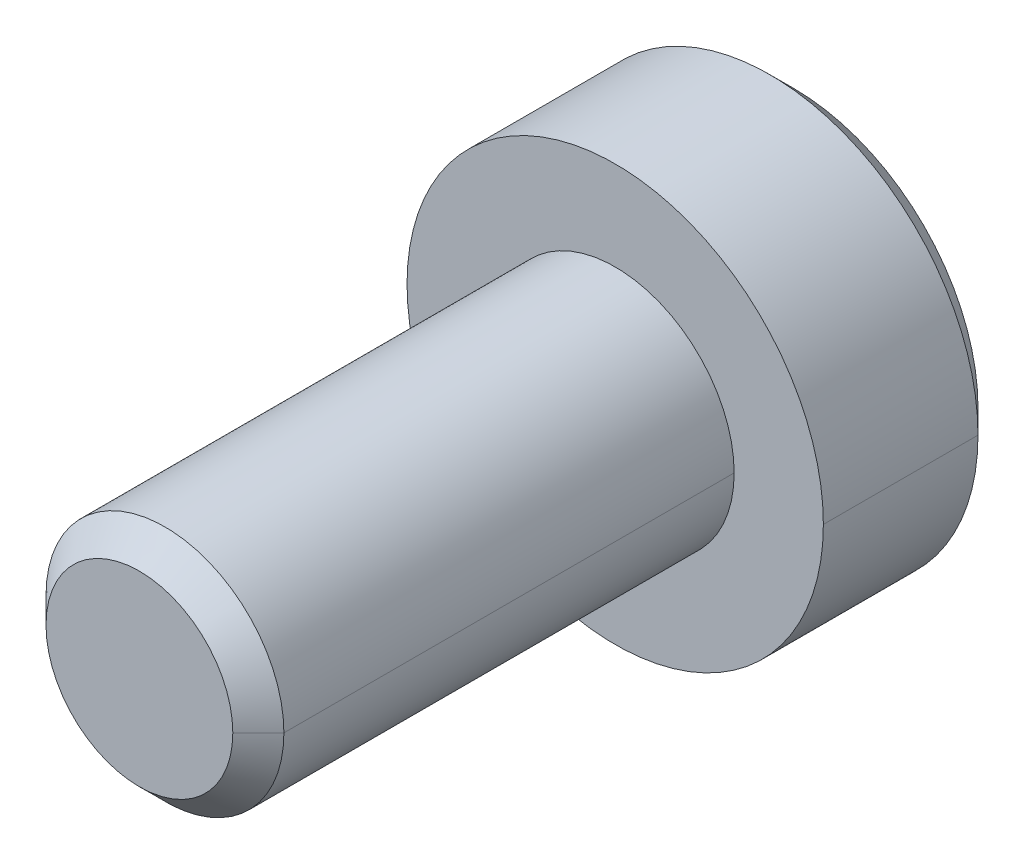
ISO-10303-21;
HEADER;
FILE_DESCRIPTION(('STEP AP214'),'2;1');
FILE_NAME('part.step','',(''),(''),'','','');
FILE_SCHEMA(('AUTOMOTIVE_DESIGN { 1 0 10303 214 1 1 1 1 }'));
ENDSEC;
DATA;
#1=APPLICATION_CONTEXT('core data for automotive mechanical design processes');
#2=APPLICATION_PROTOCOL_DEFINITION('international standard','automotive_design',2000,#1);
#3=PRODUCT_CONTEXT('',#1,'mechanical');
#4=PRODUCT('Part','Part','',(#3));
#5=PRODUCT_RELATED_PRODUCT_CATEGORY('part','',(#4));
#6=PRODUCT_DEFINITION_FORMATION('','',#4);
#7=PRODUCT_DEFINITION_CONTEXT('part definition',#1,'design');
#8=PRODUCT_DEFINITION('design','',#6,#7);
#9=PRODUCT_DEFINITION_SHAPE('','',#8);
#10=(LENGTH_UNIT() NAMED_UNIT(*) SI_UNIT(.MILLI.,.METRE.));
#11=(NAMED_UNIT(*) PLANE_ANGLE_UNIT() SI_UNIT($,.RADIAN.));
#12=(NAMED_UNIT(*) SI_UNIT($,.STERADIAN.) SOLID_ANGLE_UNIT());
#13=UNCERTAINTY_MEASURE_WITH_UNIT(LENGTH_MEASURE(1.E-05),#10,'distance_accuracy_value','');
#14=(GEOMETRIC_REPRESENTATION_CONTEXT(3) GLOBAL_UNCERTAINTY_ASSIGNED_CONTEXT((#13)) GLOBAL_UNIT_ASSIGNED_CONTEXT((#10,
#11,#12)) REPRESENTATION_CONTEXT('',''));
#15=CARTESIAN_POINT('',(0.,0.,0.));
#16=DIRECTION('',(0.,0.,1.));
#17=DIRECTION('',(1.,0.,0.));
#18=AXIS2_PLACEMENT_3D('',#15,#16,#17);
#19=CARTESIAN_POINT('',(0.,0.,2.));
#20=DIRECTION('',(0.,0.,-1.));
#21=DIRECTION('',(0.,-1.,0.));
#22=AXIS2_PLACEMENT_3D('',#19,#20,#21);
#23=PLANE('',#22);
#24=DIRECTION('',(0.866025403784439,0.5,0.));
#25=VECTOR('',#24,1.);
#26=CARTESIAN_POINT('',(-1.5,0.866025403784439,2.));
#27=LINE('',#26,#25);
#28=CARTESIAN_POINT('',(-1.5,0.866025403784439,2.));
#29=VERTEX_POINT('',#28);
#30=CARTESIAN_POINT('',(0.,1.73205080756888,2.));
#31=VERTEX_POINT('',#30);
#32=EDGE_CURVE('E166',#29,#31,#27,.T.);
#33=ORIENTED_EDGE('',*,*,#32,.T.);
#34=DIRECTION('',(0.866025403784439,-0.5,0.));
#35=VECTOR('',#34,1.);
#36=CARTESIAN_POINT('',(0.,1.73205080756888,2.));
#37=LINE('',#36,#35);
#38=CARTESIAN_POINT('',(1.5,0.866025403784439,2.));
#39=VERTEX_POINT('',#38);
#40=EDGE_CURVE('E9',#31,#39,#37,.T.);
#41=ORIENTED_EDGE('',*,*,#40,.T.);
#42=DIRECTION('',(0.,-1.,0.));
#43=VECTOR('',#42,1.);
#44=CARTESIAN_POINT('',(1.5,0.866025403784439,2.));
#45=LINE('',#44,#43);
#46=CARTESIAN_POINT('',(1.5,-0.866025403784439,2.));
#47=VERTEX_POINT('',#46);
#48=EDGE_CURVE('E67',#39,#47,#45,.T.);
#49=ORIENTED_EDGE('',*,*,#48,.T.);
#50=DIRECTION('',(-0.866025403784439,-0.5,0.));
#51=VECTOR('',#50,1.);
#52=CARTESIAN_POINT('',(1.5,-0.866025403784439,2.));
#53=LINE('',#52,#51);
#54=CARTESIAN_POINT('',(0.,-1.73205080756888,2.));
#55=VERTEX_POINT('',#54);
#56=EDGE_CURVE('E61',#47,#55,#53,.T.);
#57=ORIENTED_EDGE('',*,*,#56,.T.);
#58=DIRECTION('',(-0.866025403784439,0.5,0.));
#59=VECTOR('',#58,1.);
#60=CARTESIAN_POINT('',(0.,-1.73205080756888,2.));
#61=LINE('',#60,#59);
#62=CARTESIAN_POINT('',(-1.5,-0.86602540378444,2.));
#63=VERTEX_POINT('',#62);
#64=EDGE_CURVE('E64',#55,#63,#61,.T.);
#65=ORIENTED_EDGE('',*,*,#64,.T.);
#66=DIRECTION('',(0.,1.,0.));
#67=VECTOR('',#66,1.);
#68=CARTESIAN_POINT('',(-1.5,-0.86602540378444,2.));
#69=LINE('',#68,#67);
#70=EDGE_CURVE('E94',#63,#29,#69,.T.);
#71=ORIENTED_EDGE('',*,*,#70,.T.);
#72=EDGE_LOOP('',(#33,#41,#49,#57,#65,#71));
#73=FACE_BOUND('',#72,.T.);
#74=ADVANCED_FACE('F15',(#73),#23,.T.);
#75=CARTESIAN_POINT('',(0.,1.73205080756888,2.));
#76=DIRECTION('',(0.5,0.866025403784439,0.));
#77=DIRECTION('',(0.,0.,-1.));
#78=AXIS2_PLACEMENT_3D('',#75,#76,#77);
#79=PLANE('',#78);
#80=DIRECTION('',(0.866025403784439,-0.5,0.));
#81=VECTOR('',#80,1.);
#82=CARTESIAN_POINT('',(0.,1.73205080756888,0.));
#83=LINE('',#82,#81);
#84=CARTESIAN_POINT('',(0.,1.73205080756887,0.));
#85=VERTEX_POINT('',#84);
#86=CARTESIAN_POINT('',(1.5,0.866025403784439,0.));
#87=VERTEX_POINT('',#86);
#88=EDGE_CURVE('E120',#85,#87,#83,.T.);
#89=ORIENTED_EDGE('',*,*,#88,.T.);
#90=DIRECTION('',(0.,0.,-1.));
#91=VECTOR('',#90,1.);
#92=CARTESIAN_POINT('',(1.5,0.866025403784439,2.));
#93=LINE('',#92,#91);
#94=EDGE_CURVE('E24',#39,#87,#93,.T.);
#95=ORIENTED_EDGE('',*,*,#94,.F.);
#96=ORIENTED_EDGE('',*,*,#40,.F.);
#97=DIRECTION('',(0.,0.,-1.));
#98=VECTOR('',#97,1.);
#99=CARTESIAN_POINT('',(0.,1.73205080756888,2.));
#100=LINE('',#99,#98);
#101=EDGE_CURVE('E127',#31,#85,#100,.T.);
#102=ORIENTED_EDGE('',*,*,#101,.T.);
#103=EDGE_LOOP('',(#89,#95,#96,#102));
#104=FACE_BOUND('',#103,.T.);
#105=ADVANCED_FACE('F125',(#104),#79,.F.);
#106=CARTESIAN_POINT('',(1.5,0.866025403784439,2.));
#107=DIRECTION('',(1.,0.,0.));
#108=DIRECTION('',(0.,1.,0.));
#109=AXIS2_PLACEMENT_3D('',#106,#107,#108);
#110=PLANE('',#109);
#111=DIRECTION('',(0.,-1.,0.));
#112=VECTOR('',#111,1.);
#113=CARTESIAN_POINT('',(1.5,0.866025403784439,0.));
#114=LINE('',#113,#112);
#115=CARTESIAN_POINT('',(1.5,-0.866025403784439,0.));
#116=VERTEX_POINT('',#115);
#117=EDGE_CURVE('E108',#87,#116,#114,.T.);
#118=ORIENTED_EDGE('',*,*,#117,.T.);
#119=DIRECTION('',(0.,0.,-1.));
#120=VECTOR('',#119,1.);
#121=CARTESIAN_POINT('',(1.5,-0.866025403784439,2.));
#122=LINE('',#121,#120);
#123=EDGE_CURVE('E71',#47,#116,#122,.T.);
#124=ORIENTED_EDGE('',*,*,#123,.F.);
#125=ORIENTED_EDGE('',*,*,#48,.F.);
#126=ORIENTED_EDGE('',*,*,#94,.T.);
#127=EDGE_LOOP('',(#118,#124,#125,#126));
#128=FACE_BOUND('',#127,.T.);
#129=ADVANCED_FACE('F107',(#128),#110,.F.);
#130=CARTESIAN_POINT('',(1.5,-0.866025403784439,2.));
#131=DIRECTION('',(0.5,-0.866025403784439,0.));
#132=DIRECTION('',(0.,0.,-1.));
#133=AXIS2_PLACEMENT_3D('',#130,#131,#132);
#134=PLANE('',#133);
#135=DIRECTION('',(-0.866025403784439,-0.5,0.));
#136=VECTOR('',#135,1.);
#137=CARTESIAN_POINT('',(1.5,-0.866025403784439,0.));
#138=LINE('',#137,#136);
#139=CARTESIAN_POINT('',(0.,-1.73205080756888,0.));
#140=VERTEX_POINT('',#139);
#141=EDGE_CURVE('E78',#116,#140,#138,.T.);
#142=ORIENTED_EDGE('',*,*,#141,.T.);
#143=DIRECTION('',(0.,0.,-1.));
#144=VECTOR('',#143,1.);
#145=CARTESIAN_POINT('',(0.,-1.73205080756888,2.));
#146=LINE('',#145,#144);
#147=EDGE_CURVE('E72',#55,#140,#146,.T.);
#148=ORIENTED_EDGE('',*,*,#147,.F.);
#149=ORIENTED_EDGE('',*,*,#56,.F.);
#150=ORIENTED_EDGE('',*,*,#123,.T.);
#151=EDGE_LOOP('',(#142,#148,#149,#150));
#152=FACE_BOUND('',#151,.T.);
#153=ADVANCED_FACE('F76',(#152),#134,.F.);
#154=CARTESIAN_POINT('',(0.,-1.73205080756888,2.));
#155=DIRECTION('',(-0.5,-0.866025403784439,0.));
#156=DIRECTION('',(-0.866025403784439,0.5,0.));
#157=AXIS2_PLACEMENT_3D('',#154,#155,#156);
#158=PLANE('',#157);
#159=DIRECTION('',(-0.866025403784439,0.5,0.));
#160=VECTOR('',#159,1.);
#161=CARTESIAN_POINT('',(0.,-1.73205080756888,0.));
#162=LINE('',#161,#160);
#163=CARTESIAN_POINT('',(-1.5,-0.86602540378444,0.));
#164=VERTEX_POINT('',#163);
#165=EDGE_CURVE('E147',#140,#164,#162,.T.);
#166=ORIENTED_EDGE('',*,*,#165,.T.);
#167=DIRECTION('',(0.,0.,-1.));
#168=VECTOR('',#167,1.);
#169=CARTESIAN_POINT('',(-1.5,-0.86602540378444,2.));
#170=LINE('',#169,#168);
#171=EDGE_CURVE('E86',#63,#164,#170,.T.);
#172=ORIENTED_EDGE('',*,*,#171,.F.);
#173=ORIENTED_EDGE('',*,*,#64,.F.);
#174=ORIENTED_EDGE('',*,*,#147,.T.);
#175=EDGE_LOOP('',(#166,#172,#173,#174));
#176=FACE_BOUND('',#175,.T.);
#177=ADVANCED_FACE('F84',(#176),#158,.F.);
#178=CARTESIAN_POINT('',(-1.5,-0.86602540378444,2.));
#179=DIRECTION('',(-1.,0.,0.));
#180=DIRECTION('',(0.,1.,0.));
#181=AXIS2_PLACEMENT_3D('',#178,#179,#180);
#182=PLANE('',#181);
#183=DIRECTION('',(0.,1.,0.));
#184=VECTOR('',#183,1.);
#185=CARTESIAN_POINT('',(-1.5,-0.86602540378444,0.));
#186=LINE('',#185,#184);
#187=CARTESIAN_POINT('',(-1.5,0.866025403784439,0.));
#188=VERTEX_POINT('',#187);
#189=EDGE_CURVE('E137',#164,#188,#186,.T.);
#190=ORIENTED_EDGE('',*,*,#189,.T.);
#191=DIRECTION('',(0.,0.,-1.));
#192=VECTOR('',#191,1.);
#193=CARTESIAN_POINT('',(-1.5,0.866025403784439,2.));
#194=LINE('',#193,#192);
#195=EDGE_CURVE('E155',#29,#188,#194,.T.);
#196=ORIENTED_EDGE('',*,*,#195,.F.);
#197=ORIENTED_EDGE('',*,*,#70,.F.);
#198=ORIENTED_EDGE('',*,*,#171,.T.);
#199=EDGE_LOOP('',(#190,#196,#197,#198));
#200=FACE_BOUND('',#199,.T.);
#201=ADVANCED_FACE('F181',(#200),#182,.F.);
#202=CARTESIAN_POINT('',(-1.5,0.866025403784439,2.));
#203=DIRECTION('',(-0.5,0.866025403784439,0.));
#204=DIRECTION('',(0.,0.,1.));
#205=AXIS2_PLACEMENT_3D('',#202,#203,#204);
#206=PLANE('',#205);
#207=DIRECTION('',(0.866025403784439,0.5,0.));
#208=VECTOR('',#207,1.);
#209=CARTESIAN_POINT('',(-1.5,0.866025403784439,0.));
#210=LINE('',#209,#208);
#211=EDGE_CURVE('E130',#188,#85,#210,.T.);
#212=ORIENTED_EDGE('',*,*,#211,.T.);
#213=ORIENTED_EDGE('',*,*,#101,.F.);
#214=ORIENTED_EDGE('',*,*,#32,.F.);
#215=ORIENTED_EDGE('',*,*,#195,.T.);
#216=EDGE_LOOP('',(#212,#213,#214,#215));
#217=FACE_BOUND('',#216,.T.);
#218=ADVANCED_FACE('F175',(#217),#206,.F.);
#219=CARTESIAN_POINT('',(0.,0.,11.));
#220=DIRECTION('',(0.,0.,-1.));
#221=DIRECTION('',(-1.,0.,0.));
#222=AXIS2_PLACEMENT_3D('',#219,#220,#221);
#223=CONICAL_SURFACE('',#222,1.5705,0.785398163397446);
#224=DIRECTION('',(0.707106781186546,0.,-0.707106781186549));
#225=VECTOR('',#224,1.);
#226=CARTESIAN_POINT('',(1.5705,0.,11.));
#227=LINE('',#226,#225);
#228=CARTESIAN_POINT('',(1.5705,0.,11.));
#229=VERTEX_POINT('',#228);
#230=CARTESIAN_POINT('',(2.,0.,10.5705));
#231=VERTEX_POINT('',#230);
#232=EDGE_CURVE('E320',#229,#231,#227,.T.);
#233=ORIENTED_EDGE('',*,*,#232,.F.);
#234=CARTESIAN_POINT('',(0.,0.,11.));
#235=DIRECTION('',(0.,0.,1.));
#236=DIRECTION('',(1.,0.,0.));
#237=AXIS2_PLACEMENT_3D('',#234,#235,#236);
#238=CIRCLE('',#237,1.5705);
#239=CARTESIAN_POINT('',(-1.5705,0.,11.));
#240=VERTEX_POINT('',#239);
#241=EDGE_CURVE('E160',#240,#229,#238,.T.);
#242=ORIENTED_EDGE('',*,*,#241,.F.);
#243=DIRECTION('',(-0.707106781186546,0.,-0.707106781186549));
#244=VECTOR('',#243,1.);
#245=CARTESIAN_POINT('',(-1.5705,0.,11.));
#246=LINE('',#245,#244);
#247=CARTESIAN_POINT('',(-2.,0.,10.5705));
#248=VERTEX_POINT('',#247);
#249=EDGE_CURVE('E276',#240,#248,#246,.T.);
#250=ORIENTED_EDGE('',*,*,#249,.T.);
#251=CARTESIAN_POINT('',(0.,0.,10.5705));
#252=DIRECTION('',(0.,0.,-1.));
#253=DIRECTION('',(1.,0.,0.));
#254=AXIS2_PLACEMENT_3D('',#251,#252,#253);
#255=CIRCLE('',#254,2.);
#256=EDGE_CURVE('E122',#231,#248,#255,.T.);
#257=ORIENTED_EDGE('',*,*,#256,.F.);
#258=EDGE_LOOP('',(#233,#242,#250,#257));
#259=FACE_BOUND('',#258,.T.);
#260=ADVANCED_FACE('F340',(#259),#223,.T.);
#261=CARTESIAN_POINT('',(0.,0.,0.4));
#262=DIRECTION('',(0.,0.,1.));
#263=DIRECTION('',(1.,0.,0.));
#264=AXIS2_PLACEMENT_3D('',#261,#262,#263);
#265=CONICAL_SURFACE('',#264,3.5,0.785398163397449);
#266=DIRECTION('',(-0.707106781186548,0.,0.707106781186547));
#267=VECTOR('',#266,1.);
#268=CARTESIAN_POINT('',(-3.5,0.,0.4));
#269=LINE('',#268,#267);
#270=CARTESIAN_POINT('',(-3.1,0.,0.));
#271=VERTEX_POINT('',#270);
#272=CARTESIAN_POINT('',(-3.5,0.,0.4));
#273=VERTEX_POINT('',#272);
#274=EDGE_CURVE('E242',#271,#273,#269,.T.);
#275=ORIENTED_EDGE('',*,*,#274,.F.);
#276=CARTESIAN_POINT('',(0.,0.,0.));
#277=DIRECTION('',(0.,0.,-1.));
#278=DIRECTION('',(1.,0.,0.));
#279=AXIS2_PLACEMENT_3D('',#276,#277,#278);
#280=CIRCLE('',#279,3.1);
#281=CARTESIAN_POINT('',(3.1,0.,0.));
#282=VERTEX_POINT('',#281);
#283=EDGE_CURVE('E131',#282,#271,#280,.T.);
#284=ORIENTED_EDGE('',*,*,#283,.F.);
#285=DIRECTION('',(0.707106781186548,0.,0.707106781186547));
#286=VECTOR('',#285,1.);
#287=CARTESIAN_POINT('',(3.5,0.,0.4));
#288=LINE('',#287,#286);
#289=CARTESIAN_POINT('',(3.5,0.,0.4));
#290=VERTEX_POINT('',#289);
#291=EDGE_CURVE('E245',#282,#290,#288,.T.);
#292=ORIENTED_EDGE('',*,*,#291,.T.);
#293=CARTESIAN_POINT('',(0.,0.,0.4));
#294=DIRECTION('',(0.,0.,1.));
#295=DIRECTION('',(1.,0.,0.));
#296=AXIS2_PLACEMENT_3D('',#293,#294,#295);
#297=CIRCLE('',#296,3.5);
#298=EDGE_CURVE('E238',#273,#290,#297,.T.);
#299=ORIENTED_EDGE('',*,*,#298,.F.);
#300=EDGE_LOOP('',(#275,#284,#292,#299));
#301=FACE_BOUND('',#300,.T.);
#302=ADVANCED_FACE('F240',(#301),#265,.T.);
#303=CARTESIAN_POINT('',(0.,0.,11.));
#304=DIRECTION('',(0.,0.,1.));
#305=DIRECTION('',(1.,0.,0.));
#306=AXIS2_PLACEMENT_3D('',#303,#304,#305);
#307=PLANE('',#306);
#308=ORIENTED_EDGE('',*,*,#241,.T.);
#309=CARTESIAN_POINT('',(0.,0.,11.));
#310=DIRECTION('',(0.,0.,1.));
#311=DIRECTION('',(1.,0.,0.));
#312=AXIS2_PLACEMENT_3D('',#309,#310,#311);
#313=CIRCLE('',#312,1.5705);
#314=EDGE_CURVE('E325',#229,#240,#313,.T.);
#315=ORIENTED_EDGE('',*,*,#314,.T.);
#316=EDGE_LOOP('',(#308,#315));
#317=FACE_BOUND('',#316,.T.);
#318=ADVANCED_FACE('F334',(#317),#307,.T.);
#319=CARTESIAN_POINT('',(0.,0.,11.));
#320=DIRECTION('',(0.,0.,-1.));
#321=DIRECTION('',(-1.,0.,0.));
#322=AXIS2_PLACEMENT_3D('',#319,#320,#321);
#323=CYLINDRICAL_SURFACE('',#322,2.);
#324=DIRECTION('',(0.,0.,-1.));
#325=VECTOR('',#324,1.);
#326=CARTESIAN_POINT('',(2.,0.,11.));
#327=LINE('',#326,#325);
#328=CARTESIAN_POINT('',(2.,0.,3.));
#329=VERTEX_POINT('',#328);
#330=EDGE_CURVE('E281',#231,#329,#327,.T.);
#331=ORIENTED_EDGE('',*,*,#330,.F.);
#332=ORIENTED_EDGE('',*,*,#256,.T.);
#333=DIRECTION('',(0.,0.,-1.));
#334=VECTOR('',#333,1.);
#335=CARTESIAN_POINT('',(-2.,0.,11.));
#336=LINE('',#335,#334);
#337=CARTESIAN_POINT('',(-2.,0.,3.));
#338=VERTEX_POINT('',#337);
#339=EDGE_CURVE('E286',#248,#338,#336,.T.);
#340=ORIENTED_EDGE('',*,*,#339,.T.);
#341=CARTESIAN_POINT('',(0.,0.,3.));
#342=DIRECTION('',(0.,0.,1.));
#343=DIRECTION('',(1.,0.,0.));
#344=AXIS2_PLACEMENT_3D('',#341,#342,#343);
#345=CIRCLE('',#344,2.);
#346=EDGE_CURVE('E140',#338,#329,#345,.T.);
#347=ORIENTED_EDGE('',*,*,#346,.T.);
#348=EDGE_LOOP('',(#331,#332,#340,#347));
#349=FACE_BOUND('',#348,.T.);
#350=ADVANCED_FACE('F296',(#349),#323,.T.);
#351=CARTESIAN_POINT('',(0.,0.,0.));
#352=DIRECTION('',(0.,0.,1.));
#353=DIRECTION('',(1.,0.,0.));
#354=AXIS2_PLACEMENT_3D('',#351,#352,#353);
#355=PLANE('',#354);
#356=ORIENTED_EDGE('',*,*,#88,.F.);
#357=ORIENTED_EDGE('',*,*,#211,.F.);
#358=ORIENTED_EDGE('',*,*,#189,.F.);
#359=ORIENTED_EDGE('',*,*,#165,.F.);
#360=ORIENTED_EDGE('',*,*,#141,.F.);
#361=ORIENTED_EDGE('',*,*,#117,.F.);
#362=EDGE_LOOP('',(#356,#357,#358,#359,#360,#361));
#363=FACE_BOUND('',#362,.T.);
#364=ORIENTED_EDGE('',*,*,#283,.T.);
#365=CARTESIAN_POINT('',(0.,0.,0.));
#366=DIRECTION('',(0.,0.,-1.));
#367=DIRECTION('',(1.,0.,0.));
#368=AXIS2_PLACEMENT_3D('',#365,#366,#367);
#369=CIRCLE('',#368,3.1);
#370=EDGE_CURVE('E270',#271,#282,#369,.T.);
#371=ORIENTED_EDGE('',*,*,#370,.T.);
#372=EDGE_LOOP('',(#364,#371));
#373=FACE_BOUND('',#372,.T.);
#374=ADVANCED_FACE('F117',(#363,#373),#355,.F.);
#375=CARTESIAN_POINT('',(0.,0.,3.));
#376=DIRECTION('',(0.,0.,1.));
#377=DIRECTION('',(1.,0.,0.));
#378=AXIS2_PLACEMENT_3D('',#375,#376,#377);
#379=PLANE('',#378);
#380=ORIENTED_EDGE('',*,*,#346,.F.);
#381=CARTESIAN_POINT('',(0.,0.,3.));
#382=DIRECTION('',(0.,0.,1.));
#383=DIRECTION('',(1.,0.,0.));
#384=AXIS2_PLACEMENT_3D('',#381,#382,#383);
#385=CIRCLE('',#384,2.);
#386=EDGE_CURVE('E283',#329,#338,#385,.T.);
#387=ORIENTED_EDGE('',*,*,#386,.F.);
#388=EDGE_LOOP('',(#380,#387));
#389=FACE_BOUND('',#388,.T.);
#390=CARTESIAN_POINT('',(0.,0.,3.));
#391=DIRECTION('',(0.,0.,1.));
#392=DIRECTION('',(1.,0.,0.));
#393=AXIS2_PLACEMENT_3D('',#390,#391,#392);
#394=CIRCLE('',#393,3.5);
#395=CARTESIAN_POINT('',(-3.5,0.,3.));
#396=VERTEX_POINT('',#395);
#397=CARTESIAN_POINT('',(3.5,0.,3.));
#398=VERTEX_POINT('',#397);
#399=EDGE_CURVE('E251',#396,#398,#394,.T.);
#400=ORIENTED_EDGE('',*,*,#399,.T.);
#401=CARTESIAN_POINT('',(0.,0.,3.));
#402=DIRECTION('',(0.,0.,1.));
#403=DIRECTION('',(1.,0.,0.));
#404=AXIS2_PLACEMENT_3D('',#401,#402,#403);
#405=CIRCLE('',#404,3.5);
#406=EDGE_CURVE('E317',#398,#396,#405,.T.);
#407=ORIENTED_EDGE('',*,*,#406,.T.);
#408=EDGE_LOOP('',(#400,#407));
#409=FACE_BOUND('',#408,.T.);
#410=ADVANCED_FACE('F301',(#389,#409),#379,.T.);
#411=CARTESIAN_POINT('',(0.,0.,3.));
#412=DIRECTION('',(0.,0.,-1.));
#413=DIRECTION('',(-1.,0.,0.));
#414=AXIS2_PLACEMENT_3D('',#411,#412,#413);
#415=CYLINDRICAL_SURFACE('',#414,3.5);
#416=DIRECTION('',(0.,0.,-1.));
#417=VECTOR('',#416,1.);
#418=CARTESIAN_POINT('',(3.5,0.,3.));
#419=LINE('',#418,#417);
#420=EDGE_CURVE('E261',#398,#290,#419,.T.);
#421=ORIENTED_EDGE('',*,*,#420,.F.);
#422=ORIENTED_EDGE('',*,*,#399,.F.);
#423=DIRECTION('',(0.,0.,-1.));
#424=VECTOR('',#423,1.);
#425=CARTESIAN_POINT('',(-3.5,0.,3.));
#426=LINE('',#425,#424);
#427=EDGE_CURVE('E254',#396,#273,#426,.T.);
#428=ORIENTED_EDGE('',*,*,#427,.T.);
#429=ORIENTED_EDGE('',*,*,#298,.T.);
#430=EDGE_LOOP('',(#421,#422,#428,#429));
#431=FACE_BOUND('',#430,.T.);
#432=ADVANCED_FACE('F256',(#431),#415,.T.);
#433=CARTESIAN_POINT('',(0.,0.,3.));
#434=DIRECTION('',(0.,0.,-1.));
#435=DIRECTION('',(-1.,0.,0.));
#436=AXIS2_PLACEMENT_3D('',#433,#434,#435);
#437=CYLINDRICAL_SURFACE('',#436,3.5);
#438=ORIENTED_EDGE('',*,*,#406,.F.);
#439=ORIENTED_EDGE('',*,*,#420,.T.);
#440=CARTESIAN_POINT('',(0.,0.,0.4));
#441=DIRECTION('',(0.,0.,1.));
#442=DIRECTION('',(1.,0.,0.));
#443=AXIS2_PLACEMENT_3D('',#440,#441,#442);
#444=CIRCLE('',#443,3.5);
#445=EDGE_CURVE('E263',#290,#273,#444,.T.);
#446=ORIENTED_EDGE('',*,*,#445,.T.);
#447=ORIENTED_EDGE('',*,*,#427,.F.);
#448=EDGE_LOOP('',(#438,#439,#446,#447));
#449=FACE_BOUND('',#448,.T.);
#450=ADVANCED_FACE('F264',(#449),#437,.T.);
#451=CARTESIAN_POINT('',(0.,0.,11.));
#452=DIRECTION('',(0.,0.,-1.));
#453=DIRECTION('',(-1.,0.,0.));
#454=AXIS2_PLACEMENT_3D('',#451,#452,#453);
#455=CYLINDRICAL_SURFACE('',#454,2.);
#456=CARTESIAN_POINT('',(0.,0.,10.5705));
#457=DIRECTION('',(0.,0.,-1.));
#458=DIRECTION('',(1.,0.,0.));
#459=AXIS2_PLACEMENT_3D('',#456,#457,#458);
#460=CIRCLE('',#459,2.);
#461=EDGE_CURVE('E306',#248,#231,#460,.T.);
#462=ORIENTED_EDGE('',*,*,#461,.T.);
#463=ORIENTED_EDGE('',*,*,#330,.T.);
#464=ORIENTED_EDGE('',*,*,#386,.T.);
#465=ORIENTED_EDGE('',*,*,#339,.F.);
#466=EDGE_LOOP('',(#462,#463,#464,#465));
#467=FACE_BOUND('',#466,.T.);
#468=ADVANCED_FACE('F304',(#467),#455,.T.);
#469=CARTESIAN_POINT('',(0.,0.,0.4));
#470=DIRECTION('',(0.,0.,1.));
#471=DIRECTION('',(1.,0.,0.));
#472=AXIS2_PLACEMENT_3D('',#469,#470,#471);
#473=CONICAL_SURFACE('',#472,3.5,0.785398163397449);
#474=ORIENTED_EDGE('',*,*,#370,.F.);
#475=ORIENTED_EDGE('',*,*,#274,.T.);
#476=ORIENTED_EDGE('',*,*,#445,.F.);
#477=ORIENTED_EDGE('',*,*,#291,.F.);
#478=EDGE_LOOP('',(#474,#475,#476,#477));
#479=FACE_BOUND('',#478,.T.);
#480=ADVANCED_FACE('F268',(#479),#473,.T.);
#481=CARTESIAN_POINT('',(0.,0.,11.));
#482=DIRECTION('',(0.,0.,-1.));
#483=DIRECTION('',(-1.,0.,0.));
#484=AXIS2_PLACEMENT_3D('',#481,#482,#483);
#485=CONICAL_SURFACE('',#484,1.5705,0.785398163397446);
#486=ORIENTED_EDGE('',*,*,#314,.F.);
#487=ORIENTED_EDGE('',*,*,#232,.T.);
#488=ORIENTED_EDGE('',*,*,#461,.F.);
#489=ORIENTED_EDGE('',*,*,#249,.F.);
#490=EDGE_LOOP('',(#486,#487,#488,#489));
#491=FACE_BOUND('',#490,.T.);
#492=ADVANCED_FACE('F338',(#491),#485,.T.);
#493=CLOSED_SHELL('',(#74,#105,#129,#153,#177,#201,#218,#260,#302,#318,#350,#374,#410,#432,#450,
#468,#480,#492));
#494=MANIFOLD_SOLID_BREP('B1',#493);
#495=ADVANCED_BREP_SHAPE_REPRESENTATION('',(#18,#494),#14);
#496=SHAPE_DEFINITION_REPRESENTATION(#9,#495);
ENDSEC;
END-ISO-10303-21;
